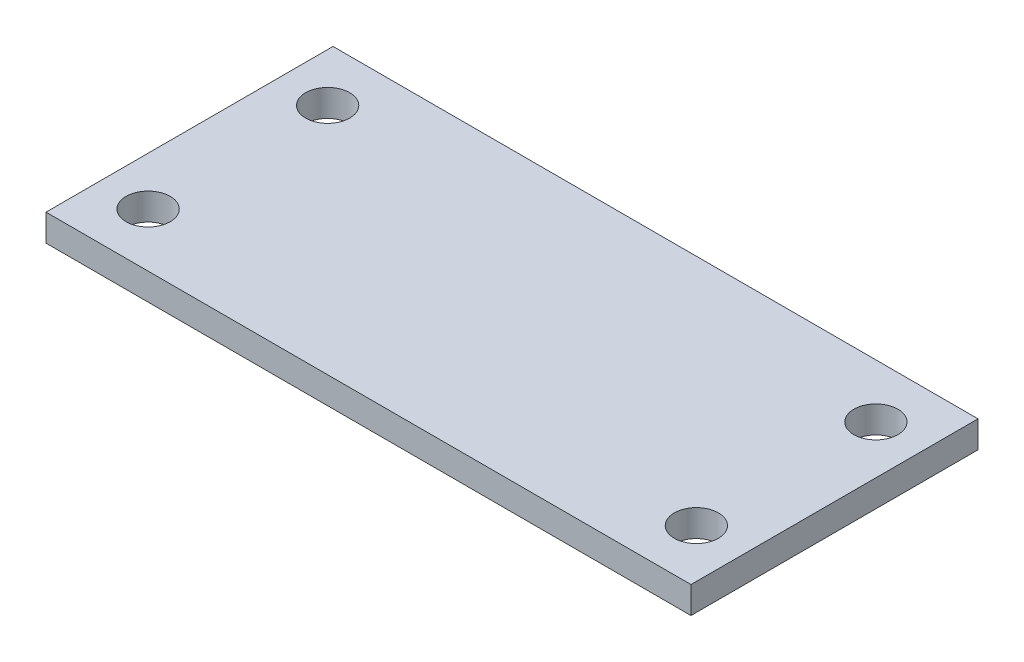
ISO-10303-21;
HEADER;
FILE_DESCRIPTION(('STEP AP214'),'2;1');
FILE_NAME('part.step','',(''),(''),'','','');
FILE_SCHEMA(('AUTOMOTIVE_DESIGN { 1 0 10303 214 1 1 1 1 }'));
ENDSEC;
DATA;
#1=APPLICATION_CONTEXT('core data for automotive mechanical design processes');
#2=APPLICATION_PROTOCOL_DEFINITION('international standard','automotive_design',2000,#1);
#3=PRODUCT_CONTEXT('',#1,'mechanical');
#4=PRODUCT('Part','Part','',(#3));
#5=PRODUCT_RELATED_PRODUCT_CATEGORY('part','',(#4));
#6=PRODUCT_DEFINITION_FORMATION('','',#4);
#7=PRODUCT_DEFINITION_CONTEXT('part definition',#1,'design');
#8=PRODUCT_DEFINITION('design','',#6,#7);
#9=PRODUCT_DEFINITION_SHAPE('','',#8);
#10=(LENGTH_UNIT() NAMED_UNIT(*) SI_UNIT(.MILLI.,.METRE.));
#11=(NAMED_UNIT(*) PLANE_ANGLE_UNIT() SI_UNIT($,.RADIAN.));
#12=(NAMED_UNIT(*) SI_UNIT($,.STERADIAN.) SOLID_ANGLE_UNIT());
#13=UNCERTAINTY_MEASURE_WITH_UNIT(LENGTH_MEASURE(1.E-05),#10,'distance_accuracy_value','');
#14=(GEOMETRIC_REPRESENTATION_CONTEXT(3) GLOBAL_UNCERTAINTY_ASSIGNED_CONTEXT((#13)) GLOBAL_UNIT_ASSIGNED_CONTEXT((#10,
#11,#12)) REPRESENTATION_CONTEXT('',''));
#15=CARTESIAN_POINT('',(0.,0.,0.));
#16=DIRECTION('',(0.,0.,1.));
#17=DIRECTION('',(1.,0.,0.));
#18=AXIS2_PLACEMENT_3D('',#15,#16,#17);
#19=CARTESIAN_POINT('',(0.,2.5,0.));
#20=DIRECTION('',(0.,1.,0.));
#21=DIRECTION('',(0.,0.,1.));
#22=AXIS2_PLACEMENT_3D('',#19,#20,#21);
#23=PLANE('',#22);
#24=CARTESIAN_POINT('',(25.5,2.5,8.35));
#25=DIRECTION('',(0.,1.,0.));
#26=DIRECTION('',(0.,0.,1.));
#27=AXIS2_PLACEMENT_3D('',#24,#25,#26);
#28=CIRCLE('',#27,2.05);
#29=CARTESIAN_POINT('',(25.5,2.5,10.4));
#30=VERTEX_POINT('',#29);
#31=EDGE_CURVE('E125',#30,#30,#28,.T.);
#32=ORIENTED_EDGE('',*,*,#31,.F.);
#33=EDGE_LOOP('',(#32));
#34=FACE_BOUND('',#33,.T.);
#35=CARTESIAN_POINT('',(-25.5,2.5,-8.35));
#36=DIRECTION('',(0.,1.,0.));
#37=DIRECTION('',(0.,0.,1.));
#38=AXIS2_PLACEMENT_3D('',#35,#36,#37);
#39=CIRCLE('',#38,2.05);
#40=CARTESIAN_POINT('',(-25.5,2.5,-6.3));
#41=VERTEX_POINT('',#40);
#42=EDGE_CURVE('E104',#41,#41,#39,.T.);
#43=ORIENTED_EDGE('',*,*,#42,.F.);
#44=EDGE_LOOP('',(#43));
#45=FACE_BOUND('',#44,.T.);
#46=DIRECTION('',(0.,0.,-1.));
#47=VECTOR('',#46,1.);
#48=CARTESIAN_POINT('',(30.,2.5,-13.35));
#49=LINE('',#48,#47);
#50=CARTESIAN_POINT('',(30.,2.5,13.35));
#51=VERTEX_POINT('',#50);
#52=CARTESIAN_POINT('',(30.,2.5,-13.35));
#53=VERTEX_POINT('',#52);
#54=EDGE_CURVE('E89',#51,#53,#49,.T.);
#55=ORIENTED_EDGE('',*,*,#54,.T.);
#56=DIRECTION('',(-1.,0.,0.));
#57=VECTOR('',#56,1.);
#58=CARTESIAN_POINT('',(-30.,2.5,-13.35));
#59=LINE('',#58,#57);
#60=CARTESIAN_POINT('',(-30.,2.5,-13.35));
#61=VERTEX_POINT('',#60);
#62=EDGE_CURVE('E84',#53,#61,#59,.T.);
#63=ORIENTED_EDGE('',*,*,#62,.T.);
#64=DIRECTION('',(0.,0.,1.));
#65=VECTOR('',#64,1.);
#66=CARTESIAN_POINT('',(-30.,2.5,-13.35));
#67=LINE('',#66,#65);
#68=CARTESIAN_POINT('',(-30.,2.5,13.35));
#69=VERTEX_POINT('',#68);
#70=EDGE_CURVE('E87',#61,#69,#67,.T.);
#71=ORIENTED_EDGE('',*,*,#70,.T.);
#72=DIRECTION('',(1.,0.,0.));
#73=VECTOR('',#72,1.);
#74=CARTESIAN_POINT('',(-30.,2.5,13.35));
#75=LINE('',#74,#73);
#76=EDGE_CURVE('E54',#69,#51,#75,.T.);
#77=ORIENTED_EDGE('',*,*,#76,.T.);
#78=EDGE_LOOP('',(#55,#63,#71,#77));
#79=FACE_BOUND('',#78,.T.);
#80=CARTESIAN_POINT('',(25.5,2.5,-8.35));
#81=DIRECTION('',(0.,1.,0.));
#82=DIRECTION('',(0.,0.,-1.));
#83=AXIS2_PLACEMENT_3D('',#80,#81,#82);
#84=CIRCLE('',#83,2.05);
#85=CARTESIAN_POINT('',(25.5,2.5,-10.4));
#86=VERTEX_POINT('',#85);
#87=EDGE_CURVE('E119',#86,#86,#84,.T.);
#88=ORIENTED_EDGE('',*,*,#87,.F.);
#89=EDGE_LOOP('',(#88));
#90=FACE_BOUND('',#89,.T.);
#91=CARTESIAN_POINT('',(-25.5,2.5,8.35));
#92=DIRECTION('',(0.,1.,0.));
#93=DIRECTION('',(0.,0.,-1.));
#94=AXIS2_PLACEMENT_3D('',#91,#92,#93);
#95=CIRCLE('',#94,2.05);
#96=CARTESIAN_POINT('',(-25.5,2.5,6.3));
#97=VERTEX_POINT('',#96);
#98=EDGE_CURVE('E131',#97,#97,#95,.T.);
#99=ORIENTED_EDGE('',*,*,#98,.F.);
#100=EDGE_LOOP('',(#99));
#101=FACE_BOUND('',#100,.T.);
#102=ADVANCED_FACE('F37',(#34,#45,#79,#90,#101),#23,.T.);
#103=CARTESIAN_POINT('',(0.,0.,0.));
#104=DIRECTION('',(0.,1.,0.));
#105=DIRECTION('',(0.,0.,1.));
#106=AXIS2_PLACEMENT_3D('',#103,#104,#105);
#107=PLANE('',#106);
#108=DIRECTION('',(0.,0.,-1.));
#109=VECTOR('',#108,1.);
#110=CARTESIAN_POINT('',(30.,0.,-13.35));
#111=LINE('',#110,#109);
#112=CARTESIAN_POINT('',(30.,0.,13.35));
#113=VERTEX_POINT('',#112);
#114=CARTESIAN_POINT('',(30.,0.,-13.35));
#115=VERTEX_POINT('',#114);
#116=EDGE_CURVE('E101',#113,#115,#111,.T.);
#117=ORIENTED_EDGE('',*,*,#116,.F.);
#118=DIRECTION('',(1.,0.,0.));
#119=VECTOR('',#118,1.);
#120=CARTESIAN_POINT('',(-30.,0.,13.35));
#121=LINE('',#120,#119);
#122=CARTESIAN_POINT('',(-30.,0.,13.35));
#123=VERTEX_POINT('',#122);
#124=EDGE_CURVE('E77',#123,#113,#121,.T.);
#125=ORIENTED_EDGE('',*,*,#124,.F.);
#126=DIRECTION('',(0.,0.,1.));
#127=VECTOR('',#126,1.);
#128=CARTESIAN_POINT('',(-30.,0.,-13.35));
#129=LINE('',#128,#127);
#130=CARTESIAN_POINT('',(-30.,0.,-13.35));
#131=VERTEX_POINT('',#130);
#132=EDGE_CURVE('E71',#131,#123,#129,.T.);
#133=ORIENTED_EDGE('',*,*,#132,.F.);
#134=DIRECTION('',(-1.,0.,0.));
#135=VECTOR('',#134,1.);
#136=CARTESIAN_POINT('',(-30.,0.,-13.35));
#137=LINE('',#136,#135);
#138=EDGE_CURVE('E93',#115,#131,#137,.T.);
#139=ORIENTED_EDGE('',*,*,#138,.F.);
#140=EDGE_LOOP('',(#117,#125,#133,#139));
#141=FACE_BOUND('',#140,.T.);
#142=CARTESIAN_POINT('',(-25.5,0.,-8.35));
#143=DIRECTION('',(0.,1.,0.));
#144=DIRECTION('',(0.,0.,1.));
#145=AXIS2_PLACEMENT_3D('',#142,#143,#144);
#146=CIRCLE('',#145,2.05);
#147=CARTESIAN_POINT('',(-25.5,0.,-6.3));
#148=VERTEX_POINT('',#147);
#149=EDGE_CURVE('E116',#148,#148,#146,.T.);
#150=ORIENTED_EDGE('',*,*,#149,.T.);
#151=EDGE_LOOP('',(#150));
#152=FACE_BOUND('',#151,.T.);
#153=CARTESIAN_POINT('',(25.5,0.,-8.35));
#154=DIRECTION('',(0.,1.,0.));
#155=DIRECTION('',(0.,0.,-1.));
#156=AXIS2_PLACEMENT_3D('',#153,#154,#155);
#157=CIRCLE('',#156,2.05);
#158=CARTESIAN_POINT('',(25.5,0.,-10.4));
#159=VERTEX_POINT('',#158);
#160=EDGE_CURVE('E122',#159,#159,#157,.T.);
#161=ORIENTED_EDGE('',*,*,#160,.T.);
#162=EDGE_LOOP('',(#161));
#163=FACE_BOUND('',#162,.T.);
#164=CARTESIAN_POINT('',(25.5,0.,8.35));
#165=DIRECTION('',(0.,1.,0.));
#166=DIRECTION('',(0.,0.,1.));
#167=AXIS2_PLACEMENT_3D('',#164,#165,#166);
#168=CIRCLE('',#167,2.05);
#169=CARTESIAN_POINT('',(25.5,0.,10.4));
#170=VERTEX_POINT('',#169);
#171=EDGE_CURVE('E128',#170,#170,#168,.T.);
#172=ORIENTED_EDGE('',*,*,#171,.T.);
#173=EDGE_LOOP('',(#172));
#174=FACE_BOUND('',#173,.T.);
#175=CARTESIAN_POINT('',(-25.5,0.,8.35));
#176=DIRECTION('',(0.,1.,0.));
#177=DIRECTION('',(0.,0.,-1.));
#178=AXIS2_PLACEMENT_3D('',#175,#176,#177);
#179=CIRCLE('',#178,2.05);
#180=CARTESIAN_POINT('',(-25.5,0.,6.3));
#181=VERTEX_POINT('',#180);
#182=EDGE_CURVE('E134',#181,#181,#179,.T.);
#183=ORIENTED_EDGE('',*,*,#182,.T.);
#184=EDGE_LOOP('',(#183));
#185=FACE_BOUND('',#184,.T.);
#186=ADVANCED_FACE('F112',(#141,#152,#163,#174,#185),#107,.F.);
#187=CARTESIAN_POINT('',(30.,2.5,-13.35));
#188=DIRECTION('',(-1.,0.,0.));
#189=DIRECTION('',(0.,0.,1.));
#190=AXIS2_PLACEMENT_3D('',#187,#188,#189);
#191=PLANE('',#190);
#192=ORIENTED_EDGE('',*,*,#116,.T.);
#193=DIRECTION('',(0.,-1.,0.));
#194=VECTOR('',#193,1.);
#195=CARTESIAN_POINT('',(30.,2.5,-13.35));
#196=LINE('',#195,#194);
#197=EDGE_CURVE('E11',#53,#115,#196,.T.);
#198=ORIENTED_EDGE('',*,*,#197,.F.);
#199=ORIENTED_EDGE('',*,*,#54,.F.);
#200=DIRECTION('',(0.,-1.,0.));
#201=VECTOR('',#200,1.);
#202=CARTESIAN_POINT('',(30.,2.5,13.35));
#203=LINE('',#202,#201);
#204=EDGE_CURVE('E97',#51,#113,#203,.T.);
#205=ORIENTED_EDGE('',*,*,#204,.T.);
#206=EDGE_LOOP('',(#192,#198,#199,#205));
#207=FACE_BOUND('',#206,.T.);
#208=ADVANCED_FACE('F39',(#207),#191,.F.);
#209=CARTESIAN_POINT('',(-30.,2.5,-13.35));
#210=DIRECTION('',(0.,0.,1.));
#211=DIRECTION('',(1.,0.,0.));
#212=AXIS2_PLACEMENT_3D('',#209,#210,#211);
#213=PLANE('',#212);
#214=ORIENTED_EDGE('',*,*,#138,.T.);
#215=DIRECTION('',(0.,-1.,0.));
#216=VECTOR('',#215,1.);
#217=CARTESIAN_POINT('',(-30.,2.5,-13.35));
#218=LINE('',#217,#216);
#219=EDGE_CURVE('E46',#61,#131,#218,.T.);
#220=ORIENTED_EDGE('',*,*,#219,.F.);
#221=ORIENTED_EDGE('',*,*,#62,.F.);
#222=ORIENTED_EDGE('',*,*,#197,.T.);
#223=EDGE_LOOP('',(#214,#220,#221,#222));
#224=FACE_BOUND('',#223,.T.);
#225=ADVANCED_FACE('F92',(#224),#213,.F.);
#226=CARTESIAN_POINT('',(-30.,2.5,-13.35));
#227=DIRECTION('',(1.,0.,0.));
#228=DIRECTION('',(0.,0.,-1.));
#229=AXIS2_PLACEMENT_3D('',#226,#227,#228);
#230=PLANE('',#229);
#231=ORIENTED_EDGE('',*,*,#132,.T.);
#232=DIRECTION('',(0.,-1.,0.));
#233=VECTOR('',#232,1.);
#234=CARTESIAN_POINT('',(-30.,2.5,13.35));
#235=LINE('',#234,#233);
#236=EDGE_CURVE('E94',#69,#123,#235,.T.);
#237=ORIENTED_EDGE('',*,*,#236,.F.);
#238=ORIENTED_EDGE('',*,*,#70,.F.);
#239=ORIENTED_EDGE('',*,*,#219,.T.);
#240=EDGE_LOOP('',(#231,#237,#238,#239));
#241=FACE_BOUND('',#240,.T.);
#242=ADVANCED_FACE('F95',(#241),#230,.F.);
#243=CARTESIAN_POINT('',(-30.,2.5,13.35));
#244=DIRECTION('',(0.,0.,-1.));
#245=DIRECTION('',(-1.,0.,0.));
#246=AXIS2_PLACEMENT_3D('',#243,#244,#245);
#247=PLANE('',#246);
#248=ORIENTED_EDGE('',*,*,#124,.T.);
#249=ORIENTED_EDGE('',*,*,#204,.F.);
#250=ORIENTED_EDGE('',*,*,#76,.F.);
#251=ORIENTED_EDGE('',*,*,#236,.T.);
#252=EDGE_LOOP('',(#248,#249,#250,#251));
#253=FACE_BOUND('',#252,.T.);
#254=ADVANCED_FACE('F109',(#253),#247,.F.);
#255=CARTESIAN_POINT('',(-25.5,2.5,-8.35));
#256=DIRECTION('',(0.,-1.,0.));
#257=DIRECTION('',(0.,0.,-1.));
#258=AXIS2_PLACEMENT_3D('',#255,#256,#257);
#259=CYLINDRICAL_SURFACE('',#258,2.05);
#260=ORIENTED_EDGE('',*,*,#42,.T.);
#261=EDGE_LOOP('',(#260));
#262=FACE_BOUND('',#261,.T.);
#263=ORIENTED_EDGE('',*,*,#149,.F.);
#264=EDGE_LOOP('',(#263));
#265=FACE_BOUND('',#264,.T.);
#266=ADVANCED_FACE('F153',(#262,#265),#259,.F.);
#267=CARTESIAN_POINT('',(25.5,2.5,-8.35));
#268=DIRECTION('',(0.,-1.,0.));
#269=DIRECTION('',(0.,0.,-1.));
#270=AXIS2_PLACEMENT_3D('',#267,#268,#269);
#271=CYLINDRICAL_SURFACE('',#270,2.05);
#272=ORIENTED_EDGE('',*,*,#87,.T.);
#273=EDGE_LOOP('',(#272));
#274=FACE_BOUND('',#273,.T.);
#275=ORIENTED_EDGE('',*,*,#160,.F.);
#276=EDGE_LOOP('',(#275));
#277=FACE_BOUND('',#276,.T.);
#278=ADVANCED_FACE('F199',(#274,#277),#271,.F.);
#279=CARTESIAN_POINT('',(25.5,2.5,8.35));
#280=DIRECTION('',(0.,-1.,0.));
#281=DIRECTION('',(0.,0.,-1.));
#282=AXIS2_PLACEMENT_3D('',#279,#280,#281);
#283=CYLINDRICAL_SURFACE('',#282,2.05);
#284=ORIENTED_EDGE('',*,*,#31,.T.);
#285=EDGE_LOOP('',(#284));
#286=FACE_BOUND('',#285,.T.);
#287=ORIENTED_EDGE('',*,*,#171,.F.);
#288=EDGE_LOOP('',(#287));
#289=FACE_BOUND('',#288,.T.);
#290=ADVANCED_FACE('F207',(#286,#289),#283,.F.);
#291=CARTESIAN_POINT('',(-25.5,2.5,8.35));
#292=DIRECTION('',(0.,-1.,0.));
#293=DIRECTION('',(0.,0.,-1.));
#294=AXIS2_PLACEMENT_3D('',#291,#292,#293);
#295=CYLINDRICAL_SURFACE('',#294,2.05);
#296=ORIENTED_EDGE('',*,*,#98,.T.);
#297=EDGE_LOOP('',(#296));
#298=FACE_BOUND('',#297,.T.);
#299=ORIENTED_EDGE('',*,*,#182,.F.);
#300=EDGE_LOOP('',(#299));
#301=FACE_BOUND('',#300,.T.);
#302=ADVANCED_FACE('F140',(#298,#301),#295,.F.);
#303=CLOSED_SHELL('',(#102,#186,#208,#225,#242,#254,#266,#278,#290,#302));
#304=MANIFOLD_SOLID_BREP('B2',#303);
#305=ADVANCED_BREP_SHAPE_REPRESENTATION('',(#18,#304),#14);
#306=SHAPE_DEFINITION_REPRESENTATION(#9,#305);
ENDSEC;
END-ISO-10303-21;
